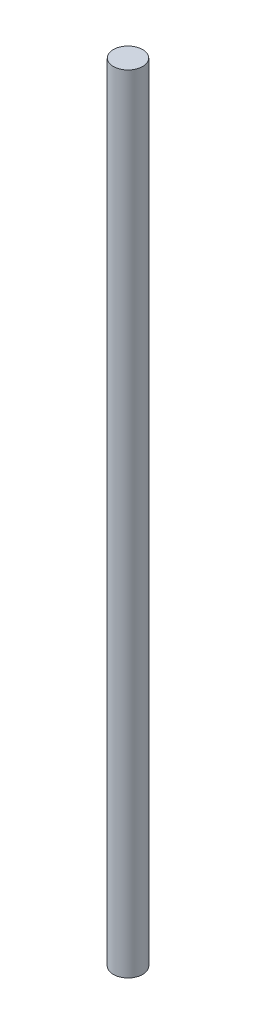
ISO-10303-21;
HEADER;
FILE_DESCRIPTION(('STEP AP214'),'2;1');
FILE_NAME('part.step','',(''),(''),'','','');
FILE_SCHEMA(('AUTOMOTIVE_DESIGN { 1 0 10303 214 1 1 1 1 }'));
ENDSEC;
DATA;
#1=APPLICATION_CONTEXT('core data for automotive mechanical design processes');
#2=APPLICATION_PROTOCOL_DEFINITION('international standard','automotive_design',2000,#1);
#3=PRODUCT_CONTEXT('',#1,'mechanical');
#4=PRODUCT('Part','Part','',(#3));
#5=PRODUCT_RELATED_PRODUCT_CATEGORY('part','',(#4));
#6=PRODUCT_DEFINITION_FORMATION('','',#4);
#7=PRODUCT_DEFINITION_CONTEXT('part definition',#1,'design');
#8=PRODUCT_DEFINITION('design','',#6,#7);
#9=PRODUCT_DEFINITION_SHAPE('','',#8);
#10=(LENGTH_UNIT() NAMED_UNIT(*) SI_UNIT(.MILLI.,.METRE.));
#11=(NAMED_UNIT(*) PLANE_ANGLE_UNIT() SI_UNIT($,.RADIAN.));
#12=(NAMED_UNIT(*) SI_UNIT($,.STERADIAN.) SOLID_ANGLE_UNIT());
#13=UNCERTAINTY_MEASURE_WITH_UNIT(LENGTH_MEASURE(1.E-05),#10,'distance_accuracy_value','');
#14=(GEOMETRIC_REPRESENTATION_CONTEXT(3) GLOBAL_UNCERTAINTY_ASSIGNED_CONTEXT((#13)) GLOBAL_UNIT_ASSIGNED_CONTEXT((#10,
#11,#12)) REPRESENTATION_CONTEXT('',''));
#15=CARTESIAN_POINT('',(0.,0.,0.));
#16=DIRECTION('',(0.,0.,1.));
#17=DIRECTION('',(1.,0.,0.));
#18=AXIS2_PLACEMENT_3D('',#15,#16,#17);
#19=CARTESIAN_POINT('',(0.,50.8,0.));
#20=DIRECTION('',(0.,-1.,0.));
#21=DIRECTION('',(0.,0.,-1.));
#22=AXIS2_PLACEMENT_3D('',#19,#20,#21);
#23=CYLINDRICAL_SURFACE('',#22,0.94869);
#24=CARTESIAN_POINT('',(0.,50.8,0.));
#25=DIRECTION('',(0.,1.,0.));
#26=DIRECTION('',(0.,0.,1.));
#27=AXIS2_PLACEMENT_3D('',#24,#25,#26);
#28=CIRCLE('',#27,0.94869);
#29=CARTESIAN_POINT('',(0.,50.8,0.94869));
#30=VERTEX_POINT('',#29);
#31=EDGE_CURVE('E10',#30,#30,#28,.T.);
#32=ORIENTED_EDGE('',*,*,#31,.F.);
#33=EDGE_LOOP('',(#32));
#34=FACE_BOUND('',#33,.T.);
#35=CARTESIAN_POINT('',(0.,0.,0.));
#36=DIRECTION('',(0.,1.,0.));
#37=DIRECTION('',(0.,0.,1.));
#38=AXIS2_PLACEMENT_3D('',#35,#36,#37);
#39=CIRCLE('',#38,0.94869);
#40=CARTESIAN_POINT('',(0.,0.,0.94869));
#41=VERTEX_POINT('',#40);
#42=EDGE_CURVE('E38',#41,#41,#39,.T.);
#43=ORIENTED_EDGE('',*,*,#42,.T.);
#44=EDGE_LOOP('',(#43));
#45=FACE_BOUND('',#44,.T.);
#46=ADVANCED_FACE('F35',(#34,#45),#23,.T.);
#47=CARTESIAN_POINT('',(0.,50.8,0.));
#48=DIRECTION('',(0.,1.,0.));
#49=DIRECTION('',(0.,0.,1.));
#50=AXIS2_PLACEMENT_3D('',#47,#48,#49);
#51=PLANE('',#50);
#52=ORIENTED_EDGE('',*,*,#31,.T.);
#53=EDGE_LOOP('',(#52));
#54=FACE_BOUND('',#53,.T.);
#55=ADVANCED_FACE('F50',(#54),#51,.T.);
#56=CARTESIAN_POINT('',(0.,0.,0.));
#57=DIRECTION('',(0.,1.,0.));
#58=DIRECTION('',(0.,0.,1.));
#59=AXIS2_PLACEMENT_3D('',#56,#57,#58);
#60=PLANE('',#59);
#61=ORIENTED_EDGE('',*,*,#42,.F.);
#62=EDGE_LOOP('',(#61));
#63=FACE_BOUND('',#62,.T.);
#64=ADVANCED_FACE('F48',(#63),#60,.F.);
#65=CLOSED_SHELL('',(#46,#55,#64));
#66=MANIFOLD_SOLID_BREP('B2',#65);
#67=ADVANCED_BREP_SHAPE_REPRESENTATION('',(#18,#66),#14);
#68=SHAPE_DEFINITION_REPRESENTATION(#9,#67);
ENDSEC;
END-ISO-10303-21;
